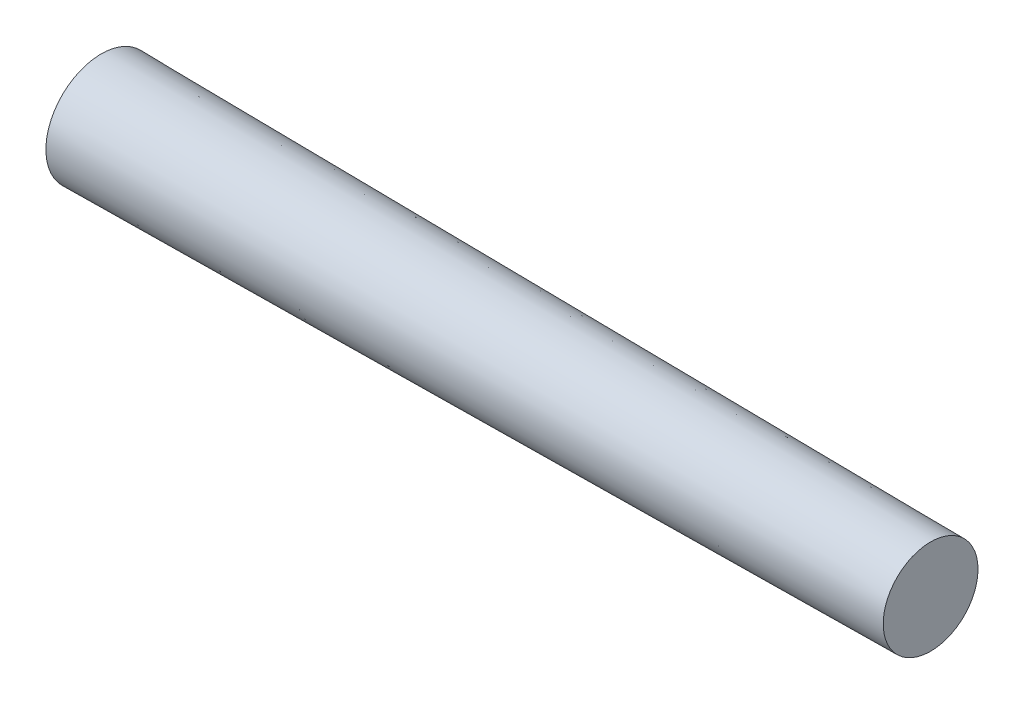
ISO-10303-21;
HEADER;
FILE_DESCRIPTION(('STEP AP214'),'2;1');
FILE_NAME('part.step','',(''),(''),'','','');
FILE_SCHEMA(('AUTOMOTIVE_DESIGN { 1 0 10303 214 1 1 1 1 }'));
ENDSEC;
DATA;
#1=APPLICATION_CONTEXT('core data for automotive mechanical design processes');
#2=APPLICATION_PROTOCOL_DEFINITION('international standard','automotive_design',2000,#1);
#3=PRODUCT_CONTEXT('',#1,'mechanical');
#4=PRODUCT('Part','Part','',(#3));
#5=PRODUCT_RELATED_PRODUCT_CATEGORY('part','',(#4));
#6=PRODUCT_DEFINITION_FORMATION('','',#4);
#7=PRODUCT_DEFINITION_CONTEXT('part definition',#1,'design');
#8=PRODUCT_DEFINITION('design','',#6,#7);
#9=PRODUCT_DEFINITION_SHAPE('','',#8);
#10=(LENGTH_UNIT() NAMED_UNIT(*) SI_UNIT(.MILLI.,.METRE.));
#11=(NAMED_UNIT(*) PLANE_ANGLE_UNIT() SI_UNIT($,.RADIAN.));
#12=(NAMED_UNIT(*) SI_UNIT($,.STERADIAN.) SOLID_ANGLE_UNIT());
#13=UNCERTAINTY_MEASURE_WITH_UNIT(LENGTH_MEASURE(1.E-05),#10,'distance_accuracy_value','');
#14=(GEOMETRIC_REPRESENTATION_CONTEXT(3) GLOBAL_UNCERTAINTY_ASSIGNED_CONTEXT((#13)) GLOBAL_UNIT_ASSIGNED_CONTEXT((#10,
#11,#12)) REPRESENTATION_CONTEXT('',''));
#15=CARTESIAN_POINT('',(0.,0.,0.));
#16=DIRECTION('',(0.,0.,1.));
#17=DIRECTION('',(1.,0.,0.));
#18=AXIS2_PLACEMENT_3D('',#15,#16,#17);
#19=CARTESIAN_POINT('',(0.,0.,0.));
#20=DIRECTION('',(1.,0.,0.));
#21=DIRECTION('',(0.,0.,-1.));
#22=AXIS2_PLACEMENT_3D('',#19,#20,#21);
#23=PLANE('',#22);
#24=CARTESIAN_POINT('',(0.,0.,0.));
#25=DIRECTION('',(1.,0.,0.));
#26=DIRECTION('',(0.,0.,-1.));
#27=AXIS2_PLACEMENT_3D('',#24,#25,#26);
#28=CIRCLE('',#27,7.);
#29=CARTESIAN_POINT('',(0.,0.,-7.));
#30=VERTEX_POINT('',#29);
#31=EDGE_CURVE('E11',#30,#30,#28,.T.);
#32=ORIENTED_EDGE('',*,*,#31,.F.);
#33=EDGE_LOOP('',(#32));
#34=FACE_BOUND('',#33,.T.);
#35=ADVANCED_FACE('F37',(#34),#23,.F.);
#36=CARTESIAN_POINT('',(105.,0.,0.));
#37=DIRECTION('',(1.,0.,0.));
#38=DIRECTION('',(0.,0.,-1.));
#39=AXIS2_PLACEMENT_3D('',#36,#37,#38);
#40=PLANE('',#39);
#41=CARTESIAN_POINT('',(105.,0.,0.));
#42=DIRECTION('',(1.,0.,0.));
#43=DIRECTION('',(0.,0.,-1.));
#44=AXIS2_PLACEMENT_3D('',#41,#42,#43);
#45=CIRCLE('',#44,6.);
#46=CARTESIAN_POINT('',(105.,0.,-6.));
#47=VERTEX_POINT('',#46);
#48=EDGE_CURVE('E45',#47,#47,#45,.T.);
#49=ORIENTED_EDGE('',*,*,#48,.T.);
#50=EDGE_LOOP('',(#49));
#51=FACE_BOUND('',#50,.T.);
#52=ADVANCED_FACE('F69',(#51),#40,.T.);
#53=CARTESIAN_POINT('',(105.,0.,0.));
#54=DIRECTION('',(-1.,0.,0.));
#55=DIRECTION('',(0.,0.,1.));
#56=AXIS2_PLACEMENT_3D('',#53,#54,#55);
#57=CONICAL_SURFACE('',#56,6.,0.00952352159361286);
#58=ORIENTED_EDGE('',*,*,#48,.F.);
#59=EDGE_LOOP('',(#58));
#60=FACE_BOUND('',#59,.T.);
#61=ORIENTED_EDGE('',*,*,#31,.T.);
#62=EDGE_LOOP('',(#61));
#63=FACE_BOUND('',#62,.T.);
#64=ADVANCED_FACE('F77',(#60,#63),#57,.T.);
#65=CLOSED_SHELL('',(#35,#52,#64));
#66=MANIFOLD_SOLID_BREP('B2',#65);
#67=ADVANCED_BREP_SHAPE_REPRESENTATION('',(#18,#66),#14);
#68=SHAPE_DEFINITION_REPRESENTATION(#9,#67);
ENDSEC;
END-ISO-10303-21;
